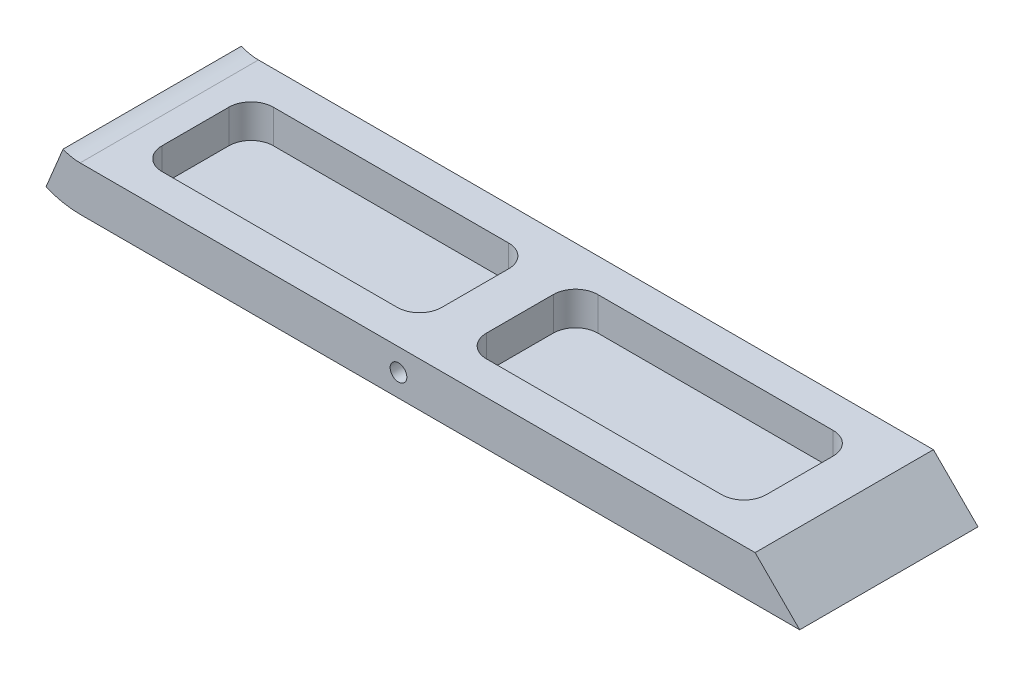
ISO-10303-21;
HEADER;
FILE_DESCRIPTION(('STEP AP214'),'2;1');
FILE_NAME('part.step','',(''),(''),'','','');
FILE_SCHEMA(('AUTOMOTIVE_DESIGN { 1 0 10303 214 1 1 1 1 }'));
ENDSEC;
DATA;
#1=APPLICATION_CONTEXT('core data for automotive mechanical design processes');
#2=APPLICATION_PROTOCOL_DEFINITION('international standard','automotive_design',2000,#1);
#3=PRODUCT_CONTEXT('',#1,'mechanical');
#4=PRODUCT('Part','Part','',(#3));
#5=PRODUCT_RELATED_PRODUCT_CATEGORY('part','',(#4));
#6=PRODUCT_DEFINITION_FORMATION('','',#4);
#7=PRODUCT_DEFINITION_CONTEXT('part definition',#1,'design');
#8=PRODUCT_DEFINITION('design','',#6,#7);
#9=PRODUCT_DEFINITION_SHAPE('','',#8);
#10=(LENGTH_UNIT() NAMED_UNIT(*) SI_UNIT(.MILLI.,.METRE.));
#11=(NAMED_UNIT(*) PLANE_ANGLE_UNIT() SI_UNIT($,.RADIAN.));
#12=(NAMED_UNIT(*) SI_UNIT($,.STERADIAN.) SOLID_ANGLE_UNIT());
#13=UNCERTAINTY_MEASURE_WITH_UNIT(LENGTH_MEASURE(1.E-05),#10,'distance_accuracy_value','');
#14=(GEOMETRIC_REPRESENTATION_CONTEXT(3) GLOBAL_UNCERTAINTY_ASSIGNED_CONTEXT((#13)) GLOBAL_UNIT_ASSIGNED_CONTEXT((#10,
#11,#12)) REPRESENTATION_CONTEXT('',''));
#15=CARTESIAN_POINT('',(0.,0.,0.));
#16=DIRECTION('',(0.,0.,1.));
#17=DIRECTION('',(1.,0.,0.));
#18=AXIS2_PLACEMENT_3D('',#15,#16,#17);
#19=CARTESIAN_POINT('',(202.8261468742,12.7,50.8));
#20=DIRECTION('',(0.,-1.,0.));
#21=DIRECTION('',(1.,0.,0.));
#22=AXIS2_PLACEMENT_3D('',#19,#20,#21);
#23=PLANE('',#22);
#24=DIRECTION('',(0.,0.,-1.));
#25=VECTOR('',#24,1.);
#26=CARTESIAN_POINT('',(190.1261468742,12.7,34.925));
#27=LINE('',#26,#25);
#28=CARTESIAN_POINT('',(190.1261468742,12.7,34.925));
#29=VERTEX_POINT('',#28);
#30=CARTESIAN_POINT('',(190.1261468742,12.7,15.875));
#31=VERTEX_POINT('',#30);
#32=EDGE_CURVE('E320',#29,#31,#27,.T.);
#33=ORIENTED_EDGE('',*,*,#32,.F.);
#34=CARTESIAN_POINT('',(183.7761468742,12.7,34.925));
#35=DIRECTION('',(0.,1.,0.));
#36=DIRECTION('',(-1.,0.,0.));
#37=AXIS2_PLACEMENT_3D('',#34,#35,#36);
#38=CIRCLE('',#37,6.35);
#39=CARTESIAN_POINT('',(183.7761468742,12.7,41.275));
#40=VERTEX_POINT('',#39);
#41=EDGE_CURVE('E278',#40,#29,#38,.T.);
#42=ORIENTED_EDGE('',*,*,#41,.F.);
#43=DIRECTION('',(1.,0.,0.));
#44=VECTOR('',#43,1.);
#45=CARTESIAN_POINT('',(183.7761468742,12.7,41.275));
#46=LINE('',#45,#44);
#47=CARTESIAN_POINT('',(116.743329558169,12.7,41.275));
#48=VERTEX_POINT('',#47);
#49=EDGE_CURVE('E297',#48,#40,#46,.T.);
#50=ORIENTED_EDGE('',*,*,#49,.F.);
#51=CARTESIAN_POINT('',(116.743329558169,12.7,34.925));
#52=DIRECTION('',(0.,1.,0.));
#53=DIRECTION('',(1.,0.,0.));
#54=AXIS2_PLACEMENT_3D('',#51,#52,#53);
#55=CIRCLE('',#54,6.35);
#56=CARTESIAN_POINT('',(110.393329558169,12.7,34.925));
#57=VERTEX_POINT('',#56);
#58=EDGE_CURVE('E335',#57,#48,#55,.T.);
#59=ORIENTED_EDGE('',*,*,#58,.F.);
#60=DIRECTION('',(0.,0.,1.));
#61=VECTOR('',#60,1.);
#62=CARTESIAN_POINT('',(110.393329558169,12.7,34.925));
#63=LINE('',#62,#61);
#64=CARTESIAN_POINT('',(110.393329558169,12.7,15.875));
#65=VERTEX_POINT('',#64);
#66=EDGE_CURVE('E332',#65,#57,#63,.T.);
#67=ORIENTED_EDGE('',*,*,#66,.F.);
#68=CARTESIAN_POINT('',(116.743329558169,12.7,15.875));
#69=DIRECTION('',(0.,1.,0.));
#70=DIRECTION('',(-1.,0.,0.));
#71=AXIS2_PLACEMENT_3D('',#68,#69,#70);
#72=CIRCLE('',#71,6.35);
#73=CARTESIAN_POINT('',(116.743329558169,12.7,9.525));
#74=VERTEX_POINT('',#73);
#75=EDGE_CURVE('E329',#74,#65,#72,.T.);
#76=ORIENTED_EDGE('',*,*,#75,.F.);
#77=DIRECTION('',(-1.,0.,0.));
#78=VECTOR('',#77,1.);
#79=CARTESIAN_POINT('',(183.7761468742,12.7,9.525));
#80=LINE('',#79,#78);
#81=CARTESIAN_POINT('',(183.7761468742,12.7,9.525));
#82=VERTEX_POINT('',#81);
#83=EDGE_CURVE('E326',#82,#74,#80,.T.);
#84=ORIENTED_EDGE('',*,*,#83,.F.);
#85=CARTESIAN_POINT('',(183.7761468742,12.7,15.875));
#86=DIRECTION('',(0.,1.,0.));
#87=DIRECTION('',(-1.,0.,0.));
#88=AXIS2_PLACEMENT_3D('',#85,#86,#87);
#89=CIRCLE('',#88,6.34999999999999);
#90=EDGE_CURVE('E323',#31,#82,#89,.T.);
#91=ORIENTED_EDGE('',*,*,#90,.F.);
#92=EDGE_LOOP('',(#33,#42,#50,#59,#67,#76,#84,#91));
#93=FACE_BOUND('',#92,.T.);
#94=DIRECTION('',(0.,0.,-1.));
#95=VECTOR('',#94,1.);
#96=CARTESIAN_POINT('',(97.6933295581691,12.7,15.875));
#97=LINE('',#96,#95);
#98=CARTESIAN_POINT('',(97.6933295581691,12.7,34.925));
#99=VERTEX_POINT('',#98);
#100=CARTESIAN_POINT('',(97.6933295581691,12.7,15.875));
#101=VERTEX_POINT('',#100);
#102=EDGE_CURVE('E256',#99,#101,#97,.T.);
#103=ORIENTED_EDGE('',*,*,#102,.F.);
#104=CARTESIAN_POINT('',(91.3433295581691,12.7,34.925));
#105=DIRECTION('',(0.,1.,0.));
#106=DIRECTION('',(1.,0.,0.));
#107=AXIS2_PLACEMENT_3D('',#104,#105,#106);
#108=CIRCLE('',#107,6.35);
#109=CARTESIAN_POINT('',(91.3433295581691,12.7,41.275));
#110=VERTEX_POINT('',#109);
#111=EDGE_CURVE('E226',#110,#99,#108,.T.);
#112=ORIENTED_EDGE('',*,*,#111,.F.);
#113=DIRECTION('',(1.,0.,0.));
#114=VECTOR('',#113,1.);
#115=CARTESIAN_POINT('',(91.3433295581691,12.7,41.275));
#116=LINE('',#115,#114);
#117=CARTESIAN_POINT('',(24.3105122421384,12.7,41.275));
#118=VERTEX_POINT('',#117);
#119=EDGE_CURVE('E233',#118,#110,#116,.T.);
#120=ORIENTED_EDGE('',*,*,#119,.F.);
#121=CARTESIAN_POINT('',(24.3105122421384,12.7,34.925));
#122=DIRECTION('',(0.,1.,0.));
#123=DIRECTION('',(1.,0.,0.));
#124=AXIS2_PLACEMENT_3D('',#121,#122,#123);
#125=CIRCLE('',#124,6.35);
#126=CARTESIAN_POINT('',(17.9605122421384,12.7,34.925));
#127=VERTEX_POINT('',#126);
#128=EDGE_CURVE('E271',#127,#118,#125,.T.);
#129=ORIENTED_EDGE('',*,*,#128,.F.);
#130=DIRECTION('',(0.,0.,1.));
#131=VECTOR('',#130,1.);
#132=CARTESIAN_POINT('',(17.9605122421384,12.7,15.875));
#133=LINE('',#132,#131);
#134=CARTESIAN_POINT('',(17.9605122421384,12.7,15.875));
#135=VERTEX_POINT('',#134);
#136=EDGE_CURVE('E268',#135,#127,#133,.T.);
#137=ORIENTED_EDGE('',*,*,#136,.F.);
#138=CARTESIAN_POINT('',(24.3105122421384,12.7,15.875));
#139=DIRECTION('',(0.,1.,0.));
#140=DIRECTION('',(-1.,0.,0.));
#141=AXIS2_PLACEMENT_3D('',#138,#139,#140);
#142=CIRCLE('',#141,6.35);
#143=CARTESIAN_POINT('',(24.3105122421384,12.7,9.525));
#144=VERTEX_POINT('',#143);
#145=EDGE_CURVE('E265',#144,#135,#142,.T.);
#146=ORIENTED_EDGE('',*,*,#145,.F.);
#147=DIRECTION('',(-1.,0.,0.));
#148=VECTOR('',#147,1.);
#149=CARTESIAN_POINT('',(91.3433295581691,12.7,9.525));
#150=LINE('',#149,#148);
#151=CARTESIAN_POINT('',(91.3433295581691,12.7,9.52500000000001));
#152=VERTEX_POINT('',#151);
#153=EDGE_CURVE('E262',#152,#144,#150,.T.);
#154=ORIENTED_EDGE('',*,*,#153,.F.);
#155=CARTESIAN_POINT('',(91.3433295581691,12.7,15.875));
#156=DIRECTION('',(0.,1.,0.));
#157=DIRECTION('',(1.,0.,0.));
#158=AXIS2_PLACEMENT_3D('',#155,#156,#157);
#159=CIRCLE('',#158,6.34999999999999);
#160=EDGE_CURVE('E259',#101,#152,#159,.T.);
#161=ORIENTED_EDGE('',*,*,#160,.F.);
#162=EDGE_LOOP('',(#103,#112,#120,#129,#137,#146,#154,#161));
#163=FACE_BOUND('',#162,.T.);
#164=DIRECTION('',(0.,0.,1.));
#165=VECTOR('',#164,1.);
#166=CARTESIAN_POINT('',(10.5210244842765,12.7,-5.3486031654054));
#167=LINE('',#166,#165);
#168=CARTESIAN_POINT('',(10.5210244842765,12.7,0.));
#169=VERTEX_POINT('',#168);
#170=CARTESIAN_POINT('',(10.5210244842765,12.7,50.8));
#171=VERTEX_POINT('',#170);
#172=EDGE_CURVE('E48',#169,#171,#167,.T.);
#173=ORIENTED_EDGE('',*,*,#172,.T.);
#174=DIRECTION('',(-1.,0.,0.));
#175=VECTOR('',#174,1.);
#176=CARTESIAN_POINT('',(202.8261468742,12.7,50.8));
#177=LINE('',#176,#175);
#178=CARTESIAN_POINT('',(202.8261468742,12.7,50.8));
#179=VERTEX_POINT('',#178);
#180=EDGE_CURVE('E203',#179,#171,#177,.T.);
#181=ORIENTED_EDGE('',*,*,#180,.F.);
#182=DIRECTION('',(0.,0.,-1.));
#183=VECTOR('',#182,1.);
#184=CARTESIAN_POINT('',(202.8261468742,12.7,50.8));
#185=LINE('',#184,#183);
#186=CARTESIAN_POINT('',(202.8261468742,12.7,0.));
#187=VERTEX_POINT('',#186);
#188=EDGE_CURVE('E41',#179,#187,#185,.T.);
#189=ORIENTED_EDGE('',*,*,#188,.T.);
#190=DIRECTION('',(-1.,0.,0.));
#191=VECTOR('',#190,1.);
#192=CARTESIAN_POINT('',(202.8261468742,12.7,0.));
#193=LINE('',#192,#191);
#194=EDGE_CURVE('E53',#187,#169,#193,.T.);
#195=ORIENTED_EDGE('',*,*,#194,.T.);
#196=EDGE_LOOP('',(#173,#181,#189,#195));
#197=FACE_BOUND('',#196,.T.);
#198=ADVANCED_FACE('F33',(#93,#163,#197),#23,.F.);
#199=CARTESIAN_POINT('',(5.26051224213825,12.7,50.8));
#200=DIRECTION('',(0.923879532511288,-0.382683432365087,0.));
#201=DIRECTION('',(0.382683432365087,0.923879532511288,0.));
#202=AXIS2_PLACEMENT_3D('',#199,#200,#201);
#203=PLANE('',#202);
#204=DIRECTION('',(-0.382683432365087,-0.923879532511288,0.));
#205=VECTOR('',#204,1.);
#206=CARTESIAN_POINT('',(5.26051224213825,12.7,0.));
#207=LINE('',#206,#205);
#208=CARTESIAN_POINT('',(5.66094489323991,13.6667299371066,0.));
#209=VERTEX_POINT('',#208);
#210=CARTESIAN_POINT('',(0.800865302203313,1.93345987421329,0.));
#211=VERTEX_POINT('',#210);
#212=EDGE_CURVE('E342',#209,#211,#207,.T.);
#213=ORIENTED_EDGE('',*,*,#212,.T.);
#214=DIRECTION('',(0.,0.,1.));
#215=VECTOR('',#214,1.);
#216=CARTESIAN_POINT('',(0.800865302203312,1.93345987421328,0.));
#217=LINE('',#216,#215);
#218=CARTESIAN_POINT('',(0.800865302203312,1.93345987421328,50.8));
#219=VERTEX_POINT('',#218);
#220=EDGE_CURVE('E188',#211,#219,#217,.T.);
#221=ORIENTED_EDGE('',*,*,#220,.T.);
#222=DIRECTION('',(-0.382683432365087,-0.923879532511288,0.));
#223=VECTOR('',#222,1.);
#224=CARTESIAN_POINT('',(5.26051224213825,12.7,50.8));
#225=LINE('',#224,#223);
#226=CARTESIAN_POINT('',(5.66094489323991,13.6667299371066,50.8));
#227=VERTEX_POINT('',#226);
#228=EDGE_CURVE('E184',#227,#219,#225,.T.);
#229=ORIENTED_EDGE('',*,*,#228,.F.);
#230=DIRECTION('',(0.,0.,1.));
#231=VECTOR('',#230,1.);
#232=CARTESIAN_POINT('',(5.66094489323991,13.6667299371066,-5.3486031654054));
#233=LINE('',#232,#231);
#234=EDGE_CURVE('E187',#209,#227,#233,.T.);
#235=ORIENTED_EDGE('',*,*,#234,.F.);
#236=EDGE_LOOP('',(#213,#221,#229,#235));
#237=FACE_BOUND('',#236,.T.);
#238=ADVANCED_FACE('F35',(#237),#203,.F.);
#239=CARTESIAN_POINT('',(0.,0.,50.8));
#240=DIRECTION('',(0.,1.,0.));
#241=DIRECTION('',(0.,0.,1.));
#242=AXIS2_PLACEMENT_3D('',#239,#240,#241);
#243=PLANE('',#242);
#244=DIRECTION('',(1.,0.,0.));
#245=VECTOR('',#244,1.);
#246=CARTESIAN_POINT('',(0.,0.,50.8));
#247=LINE('',#246,#245);
#248=CARTESIAN_POINT('',(10.5210244842765,0.,50.8));
#249=VERTEX_POINT('',#248);
#250=CARTESIAN_POINT('',(215.5261468742,0.,50.8));
#251=VERTEX_POINT('',#250);
#252=EDGE_CURVE('E192',#249,#251,#247,.T.);
#253=ORIENTED_EDGE('',*,*,#252,.F.);
#254=DIRECTION('',(0.,0.,1.));
#255=VECTOR('',#254,1.);
#256=CARTESIAN_POINT('',(10.5210244842765,0.,0.));
#257=LINE('',#256,#255);
#258=CARTESIAN_POINT('',(10.5210244842765,0.,0.));
#259=VERTEX_POINT('',#258);
#260=EDGE_CURVE('E213',#259,#249,#257,.T.);
#261=ORIENTED_EDGE('',*,*,#260,.F.);
#262=DIRECTION('',(1.,0.,0.));
#263=VECTOR('',#262,1.);
#264=CARTESIAN_POINT('',(0.,0.,0.));
#265=LINE('',#264,#263);
#266=CARTESIAN_POINT('',(215.5261468742,0.,0.));
#267=VERTEX_POINT('',#266);
#268=EDGE_CURVE('E362',#259,#267,#265,.T.);
#269=ORIENTED_EDGE('',*,*,#268,.T.);
#270=DIRECTION('',(0.,0.,-1.));
#271=VECTOR('',#270,1.);
#272=CARTESIAN_POINT('',(215.5261468742,0.,50.8));
#273=LINE('',#272,#271);
#274=EDGE_CURVE('E11',#251,#267,#273,.T.);
#275=ORIENTED_EDGE('',*,*,#274,.F.);
#276=EDGE_LOOP('',(#253,#261,#269,#275));
#277=FACE_BOUND('',#276,.T.);
#278=ADVANCED_FACE('F378',(#277),#243,.F.);
#279=CARTESIAN_POINT('',(215.5261468742,0.,50.8));
#280=DIRECTION('',(-0.707106781186548,-0.707106781186546,0.));
#281=DIRECTION('',(0.707106781186547,-0.707106781186549,0.));
#282=AXIS2_PLACEMENT_3D('',#279,#280,#281);
#283=PLANE('',#282);
#284=DIRECTION('',(-0.707106781186546,0.707106781186549,0.));
#285=VECTOR('',#284,1.);
#286=CARTESIAN_POINT('',(215.5261468742,0.,0.));
#287=LINE('',#286,#285);
#288=EDGE_CURVE('E364',#267,#187,#287,.T.);
#289=ORIENTED_EDGE('',*,*,#288,.T.);
#290=ORIENTED_EDGE('',*,*,#188,.F.);
#291=DIRECTION('',(-0.707106781186546,0.707106781186549,0.));
#292=VECTOR('',#291,1.);
#293=CARTESIAN_POINT('',(215.5261468742,0.,50.8));
#294=LINE('',#293,#292);
#295=EDGE_CURVE('E358',#251,#179,#294,.T.);
#296=ORIENTED_EDGE('',*,*,#295,.F.);
#297=ORIENTED_EDGE('',*,*,#274,.T.);
#298=EDGE_LOOP('',(#289,#290,#296,#297));
#299=FACE_BOUND('',#298,.T.);
#300=ADVANCED_FACE('F380',(#299),#283,.F.);
#301=CARTESIAN_POINT('',(0.,0.,50.8));
#302=DIRECTION('',(0.,0.,1.));
#303=DIRECTION('',(1.,0.,0.));
#304=AXIS2_PLACEMENT_3D('',#301,#302,#303);
#305=PLANE('',#304);
#306=CARTESIAN_POINT('',(10.5210244842765,25.4,50.8));
#307=DIRECTION('',(0.,0.,-1.));
#308=DIRECTION('',(-1.,0.,0.));
#309=AXIS2_PLACEMENT_3D('',#306,#307,#308);
#310=CIRCLE('',#309,25.4);
#311=EDGE_CURVE('E211',#249,#219,#310,.T.);
#312=ORIENTED_EDGE('',*,*,#311,.F.);
#313=ORIENTED_EDGE('',*,*,#252,.T.);
#314=ORIENTED_EDGE('',*,*,#295,.T.);
#315=ORIENTED_EDGE('',*,*,#180,.T.);
#316=CARTESIAN_POINT('',(10.5210244842765,25.4,50.8));
#317=DIRECTION('',(0.,0.,-1.));
#318=DIRECTION('',(-1.,0.,0.));
#319=AXIS2_PLACEMENT_3D('',#316,#317,#318);
#320=CIRCLE('',#319,12.7);
#321=EDGE_CURVE('E198',#171,#227,#320,.T.);
#322=ORIENTED_EDGE('',*,*,#321,.T.);
#323=ORIENTED_EDGE('',*,*,#228,.T.);
#324=EDGE_LOOP('',(#312,#313,#314,#315,#322,#323));
#325=FACE_BOUND('',#324,.T.);
#326=CARTESIAN_POINT('',(101.2261468742,6.35,50.8));
#327=DIRECTION('',(0.,0.,1.));
#328=DIRECTION('',(1.,0.,0.));
#329=AXIS2_PLACEMENT_3D('',#326,#327,#328);
#330=CIRCLE('',#329,2.38125000000001);
#331=CARTESIAN_POINT('',(103.6073968742,6.35,50.8));
#332=VERTEX_POINT('',#331);
#333=EDGE_CURVE('E220',#332,#332,#330,.T.);
#334=ORIENTED_EDGE('',*,*,#333,.F.);
#335=EDGE_LOOP('',(#334));
#336=FACE_BOUND('',#335,.T.);
#337=ADVANCED_FACE('F201',(#325,#336),#305,.T.);
#338=CARTESIAN_POINT('',(0.,0.,0.));
#339=DIRECTION('',(0.,0.,1.));
#340=DIRECTION('',(1.,0.,0.));
#341=AXIS2_PLACEMENT_3D('',#338,#339,#340);
#342=PLANE('',#341);
#343=CARTESIAN_POINT('',(101.2261468742,6.35,0.));
#344=DIRECTION('',(0.,0.,-1.));
#345=DIRECTION('',(-1.,0.,0.));
#346=AXIS2_PLACEMENT_3D('',#343,#344,#345);
#347=CIRCLE('',#346,2.38125000000001);
#348=CARTESIAN_POINT('',(98.8448968742,6.35,0.));
#349=VERTEX_POINT('',#348);
#350=EDGE_CURVE('E215',#349,#349,#347,.T.);
#351=ORIENTED_EDGE('',*,*,#350,.F.);
#352=EDGE_LOOP('',(#351));
#353=FACE_BOUND('',#352,.T.);
#354=ORIENTED_EDGE('',*,*,#268,.F.);
#355=CARTESIAN_POINT('',(10.5210244842765,25.4,0.));
#356=DIRECTION('',(0.,0.,-1.));
#357=DIRECTION('',(-1.,0.,0.));
#358=AXIS2_PLACEMENT_3D('',#355,#356,#357);
#359=CIRCLE('',#358,25.4);
#360=EDGE_CURVE('E208',#259,#211,#359,.T.);
#361=ORIENTED_EDGE('',*,*,#360,.T.);
#362=ORIENTED_EDGE('',*,*,#212,.F.);
#363=CARTESIAN_POINT('',(10.5210244842765,25.4,0.));
#364=DIRECTION('',(0.,0.,1.));
#365=DIRECTION('',(1.,0.,0.));
#366=AXIS2_PLACEMENT_3D('',#363,#364,#365);
#367=CIRCLE('',#366,12.7);
#368=EDGE_CURVE('E199',#209,#169,#367,.T.);
#369=ORIENTED_EDGE('',*,*,#368,.T.);
#370=ORIENTED_EDGE('',*,*,#194,.F.);
#371=ORIENTED_EDGE('',*,*,#288,.F.);
#372=EDGE_LOOP('',(#354,#361,#362,#369,#370,#371));
#373=FACE_BOUND('',#372,.T.);
#374=ADVANCED_FACE('F372',(#353,#373),#342,.F.);
#375=CARTESIAN_POINT('',(183.7761468742,3.175,34.925));
#376=DIRECTION('',(0.,1.,0.));
#377=DIRECTION('',(-1.,0.,0.));
#378=AXIS2_PLACEMENT_3D('',#375,#376,#377);
#379=CYLINDRICAL_SURFACE('',#378,6.35);
#380=ORIENTED_EDGE('',*,*,#41,.T.);
#381=DIRECTION('',(0.,1.,0.));
#382=VECTOR('',#381,1.);
#383=CARTESIAN_POINT('',(190.1261468742,3.175,34.925));
#384=LINE('',#383,#382);
#385=CARTESIAN_POINT('',(190.1261468742,3.175,34.925));
#386=VERTEX_POINT('',#385);
#387=EDGE_CURVE('E318',#386,#29,#384,.T.);
#388=ORIENTED_EDGE('',*,*,#387,.F.);
#389=CARTESIAN_POINT('',(183.7761468742,3.175,34.925));
#390=DIRECTION('',(0.,1.,0.));
#391=DIRECTION('',(-1.,0.,0.));
#392=AXIS2_PLACEMENT_3D('',#389,#390,#391);
#393=CIRCLE('',#392,6.35);
#394=CARTESIAN_POINT('',(183.7761468742,3.175,41.275));
#395=VERTEX_POINT('',#394);
#396=EDGE_CURVE('E293',#395,#386,#393,.T.);
#397=ORIENTED_EDGE('',*,*,#396,.F.);
#398=DIRECTION('',(0.,1.,0.));
#399=VECTOR('',#398,1.);
#400=CARTESIAN_POINT('',(183.7761468742,3.175,41.275));
#401=LINE('',#400,#399);
#402=EDGE_CURVE('E340',#395,#40,#401,.T.);
#403=ORIENTED_EDGE('',*,*,#402,.T.);
#404=EDGE_LOOP('',(#380,#388,#397,#403));
#405=FACE_BOUND('',#404,.T.);
#406=ADVANCED_FACE('F398',(#405),#379,.F.);
#407=CARTESIAN_POINT('',(183.7761468742,3.175,41.275));
#408=DIRECTION('',(0.,0.,1.));
#409=DIRECTION('',(1.,0.,0.));
#410=AXIS2_PLACEMENT_3D('',#407,#408,#409);
#411=PLANE('',#410);
#412=ORIENTED_EDGE('',*,*,#49,.T.);
#413=ORIENTED_EDGE('',*,*,#402,.F.);
#414=DIRECTION('',(1.,0.,0.));
#415=VECTOR('',#414,1.);
#416=CARTESIAN_POINT('',(183.7761468742,3.175,41.275));
#417=LINE('',#416,#415);
#418=CARTESIAN_POINT('',(116.743329558169,3.17499999999999,41.275));
#419=VERTEX_POINT('',#418);
#420=EDGE_CURVE('E315',#419,#395,#417,.T.);
#421=ORIENTED_EDGE('',*,*,#420,.F.);
#422=DIRECTION('',(0.,1.,0.));
#423=VECTOR('',#422,1.);
#424=CARTESIAN_POINT('',(116.743329558169,3.17499999999999,41.275));
#425=LINE('',#424,#423);
#426=EDGE_CURVE('E343',#419,#48,#425,.T.);
#427=ORIENTED_EDGE('',*,*,#426,.T.);
#428=EDGE_LOOP('',(#412,#413,#421,#427));
#429=FACE_BOUND('',#428,.T.);
#430=ADVANCED_FACE('F403',(#429),#411,.F.);
#431=CARTESIAN_POINT('',(116.743329558169,3.17499999999999,34.925));
#432=DIRECTION('',(0.,1.,0.));
#433=DIRECTION('',(-1.,0.,0.));
#434=AXIS2_PLACEMENT_3D('',#431,#432,#433);
#435=CYLINDRICAL_SURFACE('',#434,6.35);
#436=ORIENTED_EDGE('',*,*,#58,.T.);
#437=ORIENTED_EDGE('',*,*,#426,.F.);
#438=CARTESIAN_POINT('',(116.743329558169,3.17499999999999,34.925));
#439=DIRECTION('',(0.,1.,0.));
#440=DIRECTION('',(1.,0.,0.));
#441=AXIS2_PLACEMENT_3D('',#438,#439,#440);
#442=CIRCLE('',#441,6.35);
#443=CARTESIAN_POINT('',(110.393329558169,3.17499999999999,34.925));
#444=VERTEX_POINT('',#443);
#445=EDGE_CURVE('E312',#444,#419,#442,.T.);
#446=ORIENTED_EDGE('',*,*,#445,.F.);
#447=DIRECTION('',(0.,1.,0.));
#448=VECTOR('',#447,1.);
#449=CARTESIAN_POINT('',(110.393329558169,3.17499999999999,34.925));
#450=LINE('',#449,#448);
#451=EDGE_CURVE('E345',#444,#57,#450,.T.);
#452=ORIENTED_EDGE('',*,*,#451,.T.);
#453=EDGE_LOOP('',(#436,#437,#446,#452));
#454=FACE_BOUND('',#453,.T.);
#455=ADVANCED_FACE('F425',(#454),#435,.F.);
#456=CARTESIAN_POINT('',(110.393329558169,3.17499999999999,34.925));
#457=DIRECTION('',(-1.,0.,0.));
#458=DIRECTION('',(0.,-1.,0.));
#459=AXIS2_PLACEMENT_3D('',#456,#457,#458);
#460=PLANE('',#459);
#461=ORIENTED_EDGE('',*,*,#66,.T.);
#462=ORIENTED_EDGE('',*,*,#451,.F.);
#463=DIRECTION('',(0.,0.,1.));
#464=VECTOR('',#463,1.);
#465=CARTESIAN_POINT('',(110.393329558169,3.17499999999999,34.925));
#466=LINE('',#465,#464);
#467=CARTESIAN_POINT('',(110.393329558169,3.17499999999999,15.875));
#468=VERTEX_POINT('',#467);
#469=EDGE_CURVE('E309',#468,#444,#466,.T.);
#470=ORIENTED_EDGE('',*,*,#469,.F.);
#471=DIRECTION('',(0.,1.,0.));
#472=VECTOR('',#471,1.);
#473=CARTESIAN_POINT('',(110.393329558169,3.17499999999999,15.875));
#474=LINE('',#473,#472);
#475=EDGE_CURVE('E347',#468,#65,#474,.T.);
#476=ORIENTED_EDGE('',*,*,#475,.T.);
#477=EDGE_LOOP('',(#461,#462,#470,#476));
#478=FACE_BOUND('',#477,.T.);
#479=ADVANCED_FACE('F421',(#478),#460,.F.);
#480=CARTESIAN_POINT('',(116.743329558169,3.17499999999999,15.875));
#481=DIRECTION('',(0.,1.,0.));
#482=DIRECTION('',(-1.,0.,0.));
#483=AXIS2_PLACEMENT_3D('',#480,#481,#482);
#484=CYLINDRICAL_SURFACE('',#483,6.35);
#485=ORIENTED_EDGE('',*,*,#75,.T.);
#486=ORIENTED_EDGE('',*,*,#475,.F.);
#487=CARTESIAN_POINT('',(116.743329558169,3.17499999999999,15.875));
#488=DIRECTION('',(0.,1.,0.));
#489=DIRECTION('',(-1.,0.,0.));
#490=AXIS2_PLACEMENT_3D('',#487,#488,#489);
#491=CIRCLE('',#490,6.35);
#492=CARTESIAN_POINT('',(116.743329558169,3.17499999999999,9.525));
#493=VERTEX_POINT('',#492);
#494=EDGE_CURVE('E306',#493,#468,#491,.T.);
#495=ORIENTED_EDGE('',*,*,#494,.F.);
#496=DIRECTION('',(0.,1.,0.));
#497=VECTOR('',#496,1.);
#498=CARTESIAN_POINT('',(116.743329558169,3.17499999999999,9.525));
#499=LINE('',#498,#497);
#500=EDGE_CURVE('E349',#493,#74,#499,.T.);
#501=ORIENTED_EDGE('',*,*,#500,.T.);
#502=EDGE_LOOP('',(#485,#486,#495,#501));
#503=FACE_BOUND('',#502,.T.);
#504=ADVANCED_FACE('F417',(#503),#484,.F.);
#505=CARTESIAN_POINT('',(183.7761468742,3.175,9.525));
#506=DIRECTION('',(0.,0.,-1.));
#507=DIRECTION('',(-1.,0.,0.));
#508=AXIS2_PLACEMENT_3D('',#505,#506,#507);
#509=PLANE('',#508);
#510=ORIENTED_EDGE('',*,*,#83,.T.);
#511=ORIENTED_EDGE('',*,*,#500,.F.);
#512=DIRECTION('',(-1.,0.,0.));
#513=VECTOR('',#512,1.);
#514=CARTESIAN_POINT('',(183.7761468742,3.175,9.525));
#515=LINE('',#514,#513);
#516=CARTESIAN_POINT('',(183.7761468742,3.175,9.525));
#517=VERTEX_POINT('',#516);
#518=EDGE_CURVE('E303',#517,#493,#515,.T.);
#519=ORIENTED_EDGE('',*,*,#518,.F.);
#520=DIRECTION('',(0.,1.,0.));
#521=VECTOR('',#520,1.);
#522=CARTESIAN_POINT('',(183.7761468742,3.175,9.525));
#523=LINE('',#522,#521);
#524=EDGE_CURVE('E351',#517,#82,#523,.T.);
#525=ORIENTED_EDGE('',*,*,#524,.T.);
#526=EDGE_LOOP('',(#510,#511,#519,#525));
#527=FACE_BOUND('',#526,.T.);
#528=ADVANCED_FACE('F413',(#527),#509,.F.);
#529=CARTESIAN_POINT('',(183.7761468742,3.175,15.875));
#530=DIRECTION('',(0.,1.,0.));
#531=DIRECTION('',(-1.,0.,0.));
#532=AXIS2_PLACEMENT_3D('',#529,#530,#531);
#533=CYLINDRICAL_SURFACE('',#532,6.34999999999999);
#534=ORIENTED_EDGE('',*,*,#90,.T.);
#535=ORIENTED_EDGE('',*,*,#524,.F.);
#536=CARTESIAN_POINT('',(183.7761468742,3.175,15.875));
#537=DIRECTION('',(0.,1.,0.));
#538=DIRECTION('',(-1.,0.,0.));
#539=AXIS2_PLACEMENT_3D('',#536,#537,#538);
#540=CIRCLE('',#539,6.34999999999999);
#541=CARTESIAN_POINT('',(190.1261468742,3.175,15.875));
#542=VERTEX_POINT('',#541);
#543=EDGE_CURVE('E300',#542,#517,#540,.T.);
#544=ORIENTED_EDGE('',*,*,#543,.F.);
#545=DIRECTION('',(0.,1.,0.));
#546=VECTOR('',#545,1.);
#547=CARTESIAN_POINT('',(190.1261468742,3.175,15.875));
#548=LINE('',#547,#546);
#549=EDGE_CURVE('E353',#542,#31,#548,.T.);
#550=ORIENTED_EDGE('',*,*,#549,.T.);
#551=EDGE_LOOP('',(#534,#535,#544,#550));
#552=FACE_BOUND('',#551,.T.);
#553=ADVANCED_FACE('F409',(#552),#533,.F.);
#554=CARTESIAN_POINT('',(190.1261468742,3.175,34.925));
#555=DIRECTION('',(1.,0.,0.));
#556=DIRECTION('',(0.,1.,0.));
#557=AXIS2_PLACEMENT_3D('',#554,#555,#556);
#558=PLANE('',#557);
#559=ORIENTED_EDGE('',*,*,#32,.T.);
#560=ORIENTED_EDGE('',*,*,#549,.F.);
#561=DIRECTION('',(0.,0.,-1.));
#562=VECTOR('',#561,1.);
#563=CARTESIAN_POINT('',(190.1261468742,3.175,34.925));
#564=LINE('',#563,#562);
#565=EDGE_CURVE('E296',#386,#542,#564,.T.);
#566=ORIENTED_EDGE('',*,*,#565,.F.);
#567=ORIENTED_EDGE('',*,*,#387,.T.);
#568=EDGE_LOOP('',(#559,#560,#566,#567));
#569=FACE_BOUND('',#568,.T.);
#570=ADVANCED_FACE('F405',(#569),#558,.F.);
#571=CARTESIAN_POINT('',(183.7761468742,3.175,34.925));
#572=DIRECTION('',(0.,1.,0.));
#573=DIRECTION('',(-1.,0.,0.));
#574=AXIS2_PLACEMENT_3D('',#571,#572,#573);
#575=PLANE('',#574);
#576=ORIENTED_EDGE('',*,*,#396,.T.);
#577=ORIENTED_EDGE('',*,*,#565,.T.);
#578=ORIENTED_EDGE('',*,*,#543,.T.);
#579=ORIENTED_EDGE('',*,*,#518,.T.);
#580=ORIENTED_EDGE('',*,*,#494,.T.);
#581=ORIENTED_EDGE('',*,*,#469,.T.);
#582=ORIENTED_EDGE('',*,*,#445,.T.);
#583=ORIENTED_EDGE('',*,*,#420,.T.);
#584=EDGE_LOOP('',(#576,#577,#578,#579,#580,#581,#582,#583));
#585=FACE_BOUND('',#584,.T.);
#586=ADVANCED_FACE('F408',(#585),#575,.T.);
#587=CARTESIAN_POINT('',(91.3433295581691,3.17499999999999,34.925));
#588=DIRECTION('',(0.,1.,0.));
#589=DIRECTION('',(-1.,0.,0.));
#590=AXIS2_PLACEMENT_3D('',#587,#588,#589);
#591=CYLINDRICAL_SURFACE('',#590,6.35);
#592=ORIENTED_EDGE('',*,*,#111,.T.);
#593=DIRECTION('',(0.,1.,0.));
#594=VECTOR('',#593,1.);
#595=CARTESIAN_POINT('',(97.6933295581691,3.17499999999999,34.925));
#596=LINE('',#595,#594);
#597=CARTESIAN_POINT('',(97.6933295581691,3.17499999999999,34.925));
#598=VERTEX_POINT('',#597);
#599=EDGE_CURVE('E254',#598,#99,#596,.T.);
#600=ORIENTED_EDGE('',*,*,#599,.F.);
#601=CARTESIAN_POINT('',(91.3433295581691,3.17499999999999,34.925));
#602=DIRECTION('',(0.,1.,0.));
#603=DIRECTION('',(1.,0.,0.));
#604=AXIS2_PLACEMENT_3D('',#601,#602,#603);
#605=CIRCLE('',#604,6.35);
#606=CARTESIAN_POINT('',(91.3433295581691,3.17499999999999,41.275));
#607=VERTEX_POINT('',#606);
#608=EDGE_CURVE('E229',#607,#598,#605,.T.);
#609=ORIENTED_EDGE('',*,*,#608,.F.);
#610=DIRECTION('',(0.,1.,0.));
#611=VECTOR('',#610,1.);
#612=CARTESIAN_POINT('',(91.3433295581691,3.17499999999999,41.275));
#613=LINE('',#612,#611);
#614=EDGE_CURVE('E276',#607,#110,#613,.T.);
#615=ORIENTED_EDGE('',*,*,#614,.T.);
#616=EDGE_LOOP('',(#592,#600,#609,#615));
#617=FACE_BOUND('',#616,.T.);
#618=ADVANCED_FACE('F435',(#617),#591,.F.);
#619=CARTESIAN_POINT('',(91.3433295581691,3.17499999999999,41.275));
#620=DIRECTION('',(0.,0.,1.));
#621=DIRECTION('',(1.,0.,0.));
#622=AXIS2_PLACEMENT_3D('',#619,#620,#621);
#623=PLANE('',#622);
#624=ORIENTED_EDGE('',*,*,#119,.T.);
#625=ORIENTED_EDGE('',*,*,#614,.F.);
#626=DIRECTION('',(1.,0.,0.));
#627=VECTOR('',#626,1.);
#628=CARTESIAN_POINT('',(91.3433295581691,3.17499999999999,41.275));
#629=LINE('',#628,#627);
#630=CARTESIAN_POINT('',(24.3105122421384,3.17499999999998,41.275));
#631=VERTEX_POINT('',#630);
#632=EDGE_CURVE('E251',#631,#607,#629,.T.);
#633=ORIENTED_EDGE('',*,*,#632,.F.);
#634=DIRECTION('',(0.,1.,0.));
#635=VECTOR('',#634,1.);
#636=CARTESIAN_POINT('',(24.3105122421384,3.17499999999998,41.275));
#637=LINE('',#636,#635);
#638=EDGE_CURVE('E279',#631,#118,#637,.T.);
#639=ORIENTED_EDGE('',*,*,#638,.T.);
#640=EDGE_LOOP('',(#624,#625,#633,#639));
#641=FACE_BOUND('',#640,.T.);
#642=ADVANCED_FACE('F439',(#641),#623,.F.);
#643=CARTESIAN_POINT('',(24.3105122421384,3.17499999999998,34.925));
#644=DIRECTION('',(0.,1.,0.));
#645=DIRECTION('',(-1.,0.,0.));
#646=AXIS2_PLACEMENT_3D('',#643,#644,#645);
#647=CYLINDRICAL_SURFACE('',#646,6.35);
#648=ORIENTED_EDGE('',*,*,#128,.T.);
#649=ORIENTED_EDGE('',*,*,#638,.F.);
#650=CARTESIAN_POINT('',(24.3105122421384,3.17499999999998,34.925));
#651=DIRECTION('',(0.,1.,0.));
#652=DIRECTION('',(1.,0.,0.));
#653=AXIS2_PLACEMENT_3D('',#650,#651,#652);
#654=CIRCLE('',#653,6.35);
#655=CARTESIAN_POINT('',(17.9605122421384,3.17499999999998,34.925));
#656=VERTEX_POINT('',#655);
#657=EDGE_CURVE('E248',#656,#631,#654,.T.);
#658=ORIENTED_EDGE('',*,*,#657,.F.);
#659=DIRECTION('',(0.,1.,0.));
#660=VECTOR('',#659,1.);
#661=CARTESIAN_POINT('',(17.9605122421384,3.17499999999998,34.925));
#662=LINE('',#661,#660);
#663=EDGE_CURVE('E281',#656,#127,#662,.T.);
#664=ORIENTED_EDGE('',*,*,#663,.T.);
#665=EDGE_LOOP('',(#648,#649,#658,#664));
#666=FACE_BOUND('',#665,.T.);
#667=ADVANCED_FACE('F461',(#666),#647,.F.);
#668=CARTESIAN_POINT('',(17.9605122421384,3.17499999999998,15.875));
#669=DIRECTION('',(-1.,0.,0.));
#670=DIRECTION('',(0.,-1.,0.));
#671=AXIS2_PLACEMENT_3D('',#668,#669,#670);
#672=PLANE('',#671);
#673=ORIENTED_EDGE('',*,*,#136,.T.);
#674=ORIENTED_EDGE('',*,*,#663,.F.);
#675=DIRECTION('',(0.,0.,1.));
#676=VECTOR('',#675,1.);
#677=CARTESIAN_POINT('',(17.9605122421384,3.17499999999998,15.875));
#678=LINE('',#677,#676);
#679=CARTESIAN_POINT('',(17.9605122421384,3.17499999999998,15.875));
#680=VERTEX_POINT('',#679);
#681=EDGE_CURVE('E245',#680,#656,#678,.T.);
#682=ORIENTED_EDGE('',*,*,#681,.F.);
#683=DIRECTION('',(0.,1.,0.));
#684=VECTOR('',#683,1.);
#685=CARTESIAN_POINT('',(17.9605122421384,3.17499999999998,15.875));
#686=LINE('',#685,#684);
#687=EDGE_CURVE('E283',#680,#135,#686,.T.);
#688=ORIENTED_EDGE('',*,*,#687,.T.);
#689=EDGE_LOOP('',(#673,#674,#682,#688));
#690=FACE_BOUND('',#689,.T.);
#691=ADVANCED_FACE('F457',(#690),#672,.F.);
#692=CARTESIAN_POINT('',(24.3105122421384,3.17499999999998,15.875));
#693=DIRECTION('',(0.,1.,0.));
#694=DIRECTION('',(-1.,0.,0.));
#695=AXIS2_PLACEMENT_3D('',#692,#693,#694);
#696=CYLINDRICAL_SURFACE('',#695,6.35);
#697=ORIENTED_EDGE('',*,*,#145,.T.);
#698=ORIENTED_EDGE('',*,*,#687,.F.);
#699=CARTESIAN_POINT('',(24.3105122421384,3.17499999999998,15.875));
#700=DIRECTION('',(0.,1.,0.));
#701=DIRECTION('',(-1.,0.,0.));
#702=AXIS2_PLACEMENT_3D('',#699,#700,#701);
#703=CIRCLE('',#702,6.35);
#704=CARTESIAN_POINT('',(24.3105122421384,3.17499999999998,9.525));
#705=VERTEX_POINT('',#704);
#706=EDGE_CURVE('E242',#705,#680,#703,.T.);
#707=ORIENTED_EDGE('',*,*,#706,.F.);
#708=DIRECTION('',(0.,1.,0.));
#709=VECTOR('',#708,1.);
#710=CARTESIAN_POINT('',(24.3105122421384,3.17499999999998,9.525));
#711=LINE('',#710,#709);
#712=EDGE_CURVE('E285',#705,#144,#711,.T.);
#713=ORIENTED_EDGE('',*,*,#712,.T.);
#714=EDGE_LOOP('',(#697,#698,#707,#713));
#715=FACE_BOUND('',#714,.T.);
#716=ADVANCED_FACE('F453',(#715),#696,.F.);
#717=CARTESIAN_POINT('',(91.3433295581691,3.17499999999999,9.525));
#718=DIRECTION('',(0.,0.,-1.));
#719=DIRECTION('',(-1.,0.,0.));
#720=AXIS2_PLACEMENT_3D('',#717,#718,#719);
#721=PLANE('',#720);
#722=ORIENTED_EDGE('',*,*,#153,.T.);
#723=ORIENTED_EDGE('',*,*,#712,.F.);
#724=DIRECTION('',(-1.,0.,0.));
#725=VECTOR('',#724,1.);
#726=CARTESIAN_POINT('',(91.3433295581691,3.17499999999999,9.525));
#727=LINE('',#726,#725);
#728=CARTESIAN_POINT('',(91.3433295581691,3.17499999999999,9.52500000000001));
#729=VERTEX_POINT('',#728);
#730=EDGE_CURVE('E239',#729,#705,#727,.T.);
#731=ORIENTED_EDGE('',*,*,#730,.F.);
#732=DIRECTION('',(0.,1.,0.));
#733=VECTOR('',#732,1.);
#734=CARTESIAN_POINT('',(91.3433295581691,3.17499999999999,9.52500000000001));
#735=LINE('',#734,#733);
#736=EDGE_CURVE('E287',#729,#152,#735,.T.);
#737=ORIENTED_EDGE('',*,*,#736,.T.);
#738=EDGE_LOOP('',(#722,#723,#731,#737));
#739=FACE_BOUND('',#738,.T.);
#740=ADVANCED_FACE('F449',(#739),#721,.F.);
#741=CARTESIAN_POINT('',(91.3433295581691,3.17499999999999,15.875));
#742=DIRECTION('',(0.,1.,0.));
#743=DIRECTION('',(-1.,0.,0.));
#744=AXIS2_PLACEMENT_3D('',#741,#742,#743);
#745=CYLINDRICAL_SURFACE('',#744,6.34999999999999);
#746=ORIENTED_EDGE('',*,*,#160,.T.);
#747=ORIENTED_EDGE('',*,*,#736,.F.);
#748=CARTESIAN_POINT('',(91.3433295581691,3.17499999999999,15.875));
#749=DIRECTION('',(0.,1.,0.));
#750=DIRECTION('',(1.,0.,0.));
#751=AXIS2_PLACEMENT_3D('',#748,#749,#750);
#752=CIRCLE('',#751,6.34999999999999);
#753=CARTESIAN_POINT('',(97.6933295581691,3.17499999999999,15.875));
#754=VERTEX_POINT('',#753);
#755=EDGE_CURVE('E236',#754,#729,#752,.T.);
#756=ORIENTED_EDGE('',*,*,#755,.F.);
#757=DIRECTION('',(0.,1.,0.));
#758=VECTOR('',#757,1.);
#759=CARTESIAN_POINT('',(97.6933295581691,3.17499999999999,15.875));
#760=LINE('',#759,#758);
#761=EDGE_CURVE('E289',#754,#101,#760,.T.);
#762=ORIENTED_EDGE('',*,*,#761,.T.);
#763=EDGE_LOOP('',(#746,#747,#756,#762));
#764=FACE_BOUND('',#763,.T.);
#765=ADVANCED_FACE('F445',(#764),#745,.F.);
#766=CARTESIAN_POINT('',(97.6933295581691,3.17499999999999,15.875));
#767=DIRECTION('',(1.,0.,0.));
#768=DIRECTION('',(0.,1.,0.));
#769=AXIS2_PLACEMENT_3D('',#766,#767,#768);
#770=PLANE('',#769);
#771=ORIENTED_EDGE('',*,*,#102,.T.);
#772=ORIENTED_EDGE('',*,*,#761,.F.);
#773=DIRECTION('',(0.,0.,-1.));
#774=VECTOR('',#773,1.);
#775=CARTESIAN_POINT('',(97.6933295581691,3.17499999999999,15.875));
#776=LINE('',#775,#774);
#777=EDGE_CURVE('E232',#598,#754,#776,.T.);
#778=ORIENTED_EDGE('',*,*,#777,.F.);
#779=ORIENTED_EDGE('',*,*,#599,.T.);
#780=EDGE_LOOP('',(#771,#772,#778,#779));
#781=FACE_BOUND('',#780,.T.);
#782=ADVANCED_FACE('F441',(#781),#770,.F.);
#783=CARTESIAN_POINT('',(91.3433295581691,3.17499999999999,34.925));
#784=DIRECTION('',(0.,-1.,0.));
#785=DIRECTION('',(1.,0.,0.));
#786=AXIS2_PLACEMENT_3D('',#783,#784,#785);
#787=PLANE('',#786);
#788=ORIENTED_EDGE('',*,*,#608,.T.);
#789=ORIENTED_EDGE('',*,*,#777,.T.);
#790=ORIENTED_EDGE('',*,*,#755,.T.);
#791=ORIENTED_EDGE('',*,*,#730,.T.);
#792=ORIENTED_EDGE('',*,*,#706,.T.);
#793=ORIENTED_EDGE('',*,*,#681,.T.);
#794=ORIENTED_EDGE('',*,*,#657,.T.);
#795=ORIENTED_EDGE('',*,*,#632,.T.);
#796=EDGE_LOOP('',(#788,#789,#790,#791,#792,#793,#794,#795));
#797=FACE_BOUND('',#796,.T.);
#798=ADVANCED_FACE('F444',(#797),#787,.F.);
#799=CARTESIAN_POINT('',(101.2261468742,6.35,34.925));
#800=DIRECTION('',(0.,0.,1.));
#801=DIRECTION('',(1.,0.,0.));
#802=AXIS2_PLACEMENT_3D('',#799,#800,#801);
#803=CYLINDRICAL_SURFACE('',#802,2.38125000000001);
#804=CARTESIAN_POINT('',(101.2261468742,6.35,34.925));
#805=DIRECTION('',(0.,0.,1.));
#806=DIRECTION('',(1.,0.,0.));
#807=AXIS2_PLACEMENT_3D('',#804,#805,#806);
#808=CIRCLE('',#807,2.38125000000001);
#809=CARTESIAN_POINT('',(103.6073968742,6.35,34.925));
#810=VERTEX_POINT('',#809);
#811=EDGE_CURVE('E223',#810,#810,#808,.T.);
#812=ORIENTED_EDGE('',*,*,#811,.F.);
#813=EDGE_LOOP('',(#812));
#814=FACE_BOUND('',#813,.T.);
#815=ORIENTED_EDGE('',*,*,#333,.T.);
#816=EDGE_LOOP('',(#815));
#817=FACE_BOUND('',#816,.T.);
#818=ADVANCED_FACE('F471',(#814,#817),#803,.F.);
#819=CARTESIAN_POINT('',(101.2261468742,6.35,34.925));
#820=DIRECTION('',(0.,0.,1.));
#821=DIRECTION('',(1.,0.,0.));
#822=AXIS2_PLACEMENT_3D('',#819,#820,#821);
#823=PLANE('',#822);
#824=ORIENTED_EDGE('',*,*,#811,.T.);
#825=EDGE_LOOP('',(#824));
#826=FACE_BOUND('',#825,.T.);
#827=ADVANCED_FACE('F475',(#826),#823,.T.);
#828=CARTESIAN_POINT('',(101.2261468742,6.35,15.875));
#829=DIRECTION('',(0.,0.,-1.));
#830=DIRECTION('',(-1.,0.,0.));
#831=AXIS2_PLACEMENT_3D('',#828,#829,#830);
#832=CYLINDRICAL_SURFACE('',#831,2.38125000000001);
#833=CARTESIAN_POINT('',(101.2261468742,6.35,15.875));
#834=DIRECTION('',(0.,0.,-1.));
#835=DIRECTION('',(-1.,0.,0.));
#836=AXIS2_PLACEMENT_3D('',#833,#834,#835);
#837=CIRCLE('',#836,2.38125000000001);
#838=CARTESIAN_POINT('',(98.8448968742,6.35,15.875));
#839=VERTEX_POINT('',#838);
#840=EDGE_CURVE('E217',#839,#839,#837,.T.);
#841=ORIENTED_EDGE('',*,*,#840,.F.);
#842=EDGE_LOOP('',(#841));
#843=FACE_BOUND('',#842,.T.);
#844=ORIENTED_EDGE('',*,*,#350,.T.);
#845=EDGE_LOOP('',(#844));
#846=FACE_BOUND('',#845,.T.);
#847=ADVANCED_FACE('F479',(#843,#846),#832,.F.);
#848=CARTESIAN_POINT('',(101.2261468742,6.35,15.875));
#849=DIRECTION('',(0.,0.,-1.));
#850=DIRECTION('',(-1.,0.,0.));
#851=AXIS2_PLACEMENT_3D('',#848,#849,#850);
#852=PLANE('',#851);
#853=ORIENTED_EDGE('',*,*,#840,.T.);
#854=EDGE_LOOP('',(#853));
#855=FACE_BOUND('',#854,.T.);
#856=ADVANCED_FACE('F483',(#855),#852,.T.);
#857=CARTESIAN_POINT('',(10.5210244842765,25.4,0.));
#858=DIRECTION('',(0.,0.,1.));
#859=DIRECTION('',(1.,0.,0.));
#860=AXIS2_PLACEMENT_3D('',#857,#858,#859);
#861=CYLINDRICAL_SURFACE('',#860,25.4);
#862=ORIENTED_EDGE('',*,*,#311,.T.);
#863=ORIENTED_EDGE('',*,*,#220,.F.);
#864=ORIENTED_EDGE('',*,*,#360,.F.);
#865=ORIENTED_EDGE('',*,*,#260,.T.);
#866=EDGE_LOOP('',(#862,#863,#864,#865));
#867=FACE_BOUND('',#866,.T.);
#868=ADVANCED_FACE('F375',(#867),#861,.T.);
#869=CARTESIAN_POINT('',(10.5210244842765,25.4,-5.3486031654054));
#870=DIRECTION('',(0.,0.,1.));
#871=DIRECTION('',(1.,0.,0.));
#872=AXIS2_PLACEMENT_3D('',#869,#870,#871);
#873=CYLINDRICAL_SURFACE('',#872,12.7);
#874=ORIENTED_EDGE('',*,*,#368,.F.);
#875=ORIENTED_EDGE('',*,*,#234,.T.);
#876=ORIENTED_EDGE('',*,*,#321,.F.);
#877=ORIENTED_EDGE('',*,*,#172,.F.);
#878=EDGE_LOOP('',(#874,#875,#876,#877));
#879=FACE_BOUND('',#878,.T.);
#880=ADVANCED_FACE('F197',(#879),#873,.F.);
#881=CLOSED_SHELL('',(#198,#238,#278,#300,#337,#374,#406,#430,#455,#479,#504,#528,#553,#570,
#586,#618,#642,#667,#691,#716,#740,#765,#782,#798,#818,#827,#847,#856,#868,#880));
#882=MANIFOLD_SOLID_BREP('B2',#881);
#883=ADVANCED_BREP_SHAPE_REPRESENTATION('',(#18,#882),#14);
#884=SHAPE_DEFINITION_REPRESENTATION(#9,#883);
ENDSEC;
END-ISO-10303-21;
